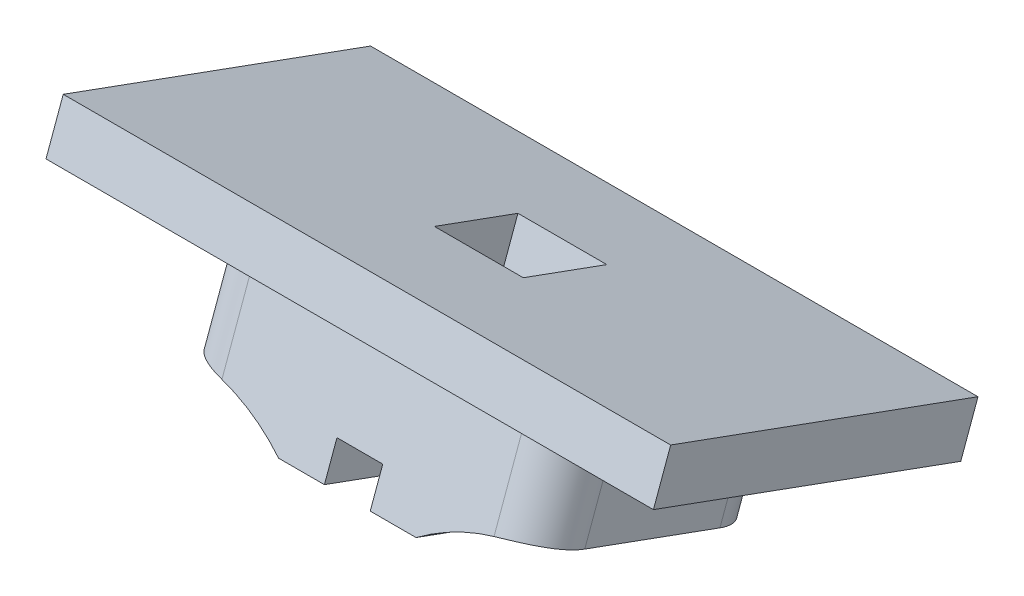
ISO-10303-21;
HEADER;
FILE_DESCRIPTION(('STEP AP214'),'2;1');
FILE_NAME('part.step','',(''),(''),'','','');
FILE_SCHEMA(('AUTOMOTIVE_DESIGN { 1 0 10303 214 1 1 1 1 }'));
ENDSEC;
DATA;
#1=APPLICATION_CONTEXT('core data for automotive mechanical design processes');
#2=APPLICATION_PROTOCOL_DEFINITION('international standard','automotive_design',2000,#1);
#3=PRODUCT_CONTEXT('',#1,'mechanical');
#4=PRODUCT('Part','Part','',(#3));
#5=PRODUCT_RELATED_PRODUCT_CATEGORY('part','',(#4));
#6=PRODUCT_DEFINITION_FORMATION('','',#4);
#7=PRODUCT_DEFINITION_CONTEXT('part definition',#1,'design');
#8=PRODUCT_DEFINITION('design','',#6,#7);
#9=PRODUCT_DEFINITION_SHAPE('','',#8);
#10=(LENGTH_UNIT() NAMED_UNIT(*) SI_UNIT(.MILLI.,.METRE.));
#11=(NAMED_UNIT(*) PLANE_ANGLE_UNIT() SI_UNIT($,.RADIAN.));
#12=(NAMED_UNIT(*) SI_UNIT($,.STERADIAN.) SOLID_ANGLE_UNIT());
#13=UNCERTAINTY_MEASURE_WITH_UNIT(LENGTH_MEASURE(1.E-05),#10,'distance_accuracy_value','');
#14=(GEOMETRIC_REPRESENTATION_CONTEXT(3) GLOBAL_UNCERTAINTY_ASSIGNED_CONTEXT((#13)) GLOBAL_UNIT_ASSIGNED_CONTEXT((#10,
#11,#12)) REPRESENTATION_CONTEXT('',''));
#15=CARTESIAN_POINT('',(0.,0.,0.));
#16=DIRECTION('',(0.,0.,1.));
#17=DIRECTION('',(1.,0.,0.));
#18=AXIS2_PLACEMENT_3D('',#15,#16,#17);
#19=CARTESIAN_POINT('',(-3.95,-152.499400824487,40.7595126358428));
#20=DIRECTION('',(0.,-0.34202014332567,-0.939692620785908));
#21=DIRECTION('',(0.,0.939692620785908,-0.34202014332567));
#22=AXIS2_PLACEMENT_3D('',#19,#20,#21);
#23=PLANE('',#22);
#24=CARTESIAN_POINT('',(2.98999999999998,-145.409009990394,38.1788214229189));
#25=DIRECTION('',(0.,-0.34202014332567,-0.939692620785908));
#26=DIRECTION('',(0.,0.939692620785908,-0.34202014332567));
#27=AXIS2_PLACEMENT_3D('',#24,#25,#26);
#28=CIRCLE('',#27,4.21306250000007);
#29=CARTESIAN_POINT('',(1.98999999999998,-141.563164173265,36.7790480199069));
#30=VERTEX_POINT('',#29);
#31=CARTESIAN_POINT('',(0.520000000000069,-142.201780344863,37.0114852974894));
#32=VERTEX_POINT('',#31);
#33=EDGE_CURVE('E63',#30,#32,#28,.F.);
#34=ORIENTED_EDGE('',*,*,#33,.F.);
#35=DIRECTION('',(0.,0.939692620785908,-0.34202014332567));
#36=VECTOR('',#35,1.);
#37=CARTESIAN_POINT('',(1.98999999999998,-152.499400824487,40.7595126358428));
#38=LINE('',#37,#36);
#39=CARTESIAN_POINT('',(1.98999999999998,-139.476671744584,36.019626881845));
#40=VERTEX_POINT('',#39);
#41=EDGE_CURVE('E368',#30,#40,#38,.T.);
#42=ORIENTED_EDGE('',*,*,#41,.T.);
#43=DIRECTION('',(-1.,0.,0.));
#44=VECTOR('',#43,1.);
#45=CARTESIAN_POINT('',(-3.95,-139.476671744584,36.019626881845));
#46=LINE('',#45,#44);
#47=CARTESIAN_POINT('',(-3.95,-139.476671744584,36.019626881845));
#48=VERTEX_POINT('',#47);
#49=EDGE_CURVE('E456',#40,#48,#46,.T.);
#50=ORIENTED_EDGE('',*,*,#49,.T.);
#51=DIRECTION('',(0.,0.939692620785908,-0.34202014332567));
#52=VECTOR('',#51,1.);
#53=CARTESIAN_POINT('',(-3.95,-152.499400824487,40.7595126358428));
#54=LINE('',#53,#52);
#55=CARTESIAN_POINT('',(-3.95,-141.563164173265,36.7790480199069));
#56=VERTEX_POINT('',#55);
#57=EDGE_CURVE('E459',#56,#48,#54,.T.);
#58=ORIENTED_EDGE('',*,*,#57,.F.);
#59=CARTESIAN_POINT('',(-4.95,-145.409009990394,38.178821422919));
#60=DIRECTION('',(0.,-0.34202014332567,-0.939692620785908));
#61=DIRECTION('',(0.,0.939692620785908,-0.34202014332567));
#62=AXIS2_PLACEMENT_3D('',#59,#60,#61);
#63=CIRCLE('',#62,4.21306250000007);
#64=CARTESIAN_POINT('',(-2.48000000000001,-142.201780344863,37.0114852974894));
#65=VERTEX_POINT('',#64);
#66=EDGE_CURVE('E297',#56,#65,#63,.T.);
#67=ORIENTED_EDGE('',*,*,#66,.T.);
#68=DIRECTION('',(1.,0.,0.));
#69=VECTOR('',#68,1.);
#70=CARTESIAN_POINT('',(-3.95,-142.201780344863,37.0114852974894));
#71=LINE('',#70,#69);
#72=CARTESIAN_POINT('',(-1.48000000000001,-142.201780344863,37.0114852974894));
#73=VERTEX_POINT('',#72);
#74=EDGE_CURVE('E380',#65,#73,#71,.T.);
#75=ORIENTED_EDGE('',*,*,#74,.T.);
#76=DIRECTION('',(0.,0.939692620785908,-0.34202014332567));
#77=VECTOR('',#76,1.);
#78=CARTESIAN_POINT('',(-1.48,-152.499400824487,40.7595126358428));
#79=LINE('',#78,#77);
#80=CARTESIAN_POINT('',(-1.48000000000001,-141.450026248234,36.7378691828289));
#81=VERTEX_POINT('',#80);
#82=EDGE_CURVE('E430',#73,#81,#79,.T.);
#83=ORIENTED_EDGE('',*,*,#82,.T.);
#84=DIRECTION('',(1.,0.,0.));
#85=VECTOR('',#84,1.);
#86=CARTESIAN_POINT('',(-3.95,-141.450026248234,36.7378691828289));
#87=LINE('',#86,#85);
#88=CARTESIAN_POINT('',(-0.48000000000001,-141.450026248234,36.7378691828289));
#89=VERTEX_POINT('',#88);
#90=EDGE_CURVE('E437',#81,#89,#87,.T.);
#91=ORIENTED_EDGE('',*,*,#90,.T.);
#92=DIRECTION('',(0.,-0.939692620785908,0.34202014332567));
#93=VECTOR('',#92,1.);
#94=CARTESIAN_POINT('',(-0.48000000000001,-152.499400824487,40.7595126358428));
#95=LINE('',#94,#93);
#96=CARTESIAN_POINT('',(-0.48000000000001,-142.201780344863,37.0114852974894));
#97=VERTEX_POINT('',#96);
#98=EDGE_CURVE('E296',#89,#97,#95,.T.);
#99=ORIENTED_EDGE('',*,*,#98,.T.);
#100=EDGE_CURVE('E377',#97,#32,#71,.T.);
#101=ORIENTED_EDGE('',*,*,#100,.T.);
#102=EDGE_LOOP('',(#34,#42,#50,#58,#67,#75,#83,#91,#99,#101));
#103=FACE_BOUND('',#102,.T.);
#104=ADVANCED_FACE('F41',(#103),#23,.F.);
#105=CARTESIAN_POINT('',(1.98999999999998,-152.841420967813,39.8198200150569));
#106=DIRECTION('',(0.,0.939692620785908,-0.34202014332567));
#107=DIRECTION('',(0.,0.34202014332567,0.939692620785908));
#108=AXIS2_PLACEMENT_3D('',#105,#106,#107);
#109=CYLINDRICAL_SURFACE('',#108,1.);
#110=CARTESIAN_POINT('',(2.98999999999999,-141.79204639156,35.798176562043));
#111=CARTESIAN_POINT('',(2.98999981089762,-141.782430627456,35.8246003928696));
#112=CARTESIAN_POINT('',(2.98881323349564,-141.772816253737,35.8510103987671));
#113=CARTESIAN_POINT('',(2.98407947173324,-141.753662740468,35.9036440730904));
#114=CARTESIAN_POINT('',(2.98053239500554,-141.744123597509,35.9298677499574));
#115=CARTESIAN_POINT('',(2.9663831501654,-141.715755726127,36.0079440903159));
#116=CARTESIAN_POINT('',(2.95227288035967,-141.697146284109,36.0592849972348));
#117=CARTESIAN_POINT('',(2.91508864291902,-141.661334197043,36.1591341537159));
#118=CARTESIAN_POINT('',(2.89201009605694,-141.644132276118,36.2076409415902));
#119=CARTESIAN_POINT('',(2.83755084831836,-141.612027729396,36.3005841327094));
#120=CARTESIAN_POINT('',(2.80617154510596,-141.59712471718,36.345021219508));
#121=CARTESIAN_POINT('',(2.7361073282988,-141.570573934311,36.4286297009068));
#122=CARTESIAN_POINT('',(2.69743980668151,-141.55891857456,36.4678132587411));
#123=CARTESIAN_POINT('',(2.61390616137842,-141.53968340188,36.5401073207501));
#124=CARTESIAN_POINT('',(2.56904027416754,-141.532103433523,36.5732180564979));
#125=CARTESIAN_POINT('',(2.47495723246723,-141.52178511548,36.6323312982211));
#126=CARTESIAN_POINT('',(2.42578605235699,-141.519000924137,36.6583990753581));
#127=CARTESIAN_POINT('',(2.32423345518071,-141.518594377797,36.7033311777244));
#128=CARTESIAN_POINT('',(2.27185268727983,-141.520970982316,36.7221969540722));
#129=CARTESIAN_POINT('',(2.18098361680717,-141.529569693242,36.7480470944907));
#130=CARTESIAN_POINT('',(2.14288144224999,-141.534473656925,36.7568910024878));
#131=CARTESIAN_POINT('',(2.06647677901283,-141.546884747217,36.7707956767958));
#132=CARTESIAN_POINT('',(2.02817472137313,-141.554387591081,36.7758626241977));
#133=CARTESIAN_POINT('',(1.98999999999999,-141.563164173265,36.7790480199069));
#134=B_SPLINE_CURVE_WITH_KNOTS('',3,(#110,#111,#112,#113,#114,#115,#116,#117,#118,#119,#120,
#121,#122,#123,#124,#125,#126,#127,#128,#129,#130,#131,#132,#133),.UNSPECIFIED.,.F.,.F.,(4,2,2,
2,2,2,2,2,2,2,2,4),(0.,0.0843054131839854,0.168606982519986,0.336948632178145,0.505376350731911,
0.673775727807577,0.84177822533461,1.00977431513839,1.17615547140108,1.34250308610157,
1.46051200876002,1.57832738027522),.UNSPECIFIED.);
#135=CARTESIAN_POINT('',(2.98999999999998,-141.79204639156,35.798176562043));
#136=VERTEX_POINT('',#135);
#137=EDGE_CURVE('E238',#136,#30,#134,.T.);
#138=ORIENTED_EDGE('',*,*,#137,.F.);
#139=DIRECTION('',(0.,0.939692620785908,-0.34202014332567));
#140=VECTOR('',#139,1.);
#141=CARTESIAN_POINT('',(2.98999999999998,-152.841420967813,39.8198200150569));
#142=LINE('',#141,#140);
#143=CARTESIAN_POINT('',(2.98999999999998,-139.81869188791,35.0799342610591));
#144=VERTEX_POINT('',#143);
#145=EDGE_CURVE('E357',#136,#144,#142,.T.);
#146=ORIENTED_EDGE('',*,*,#145,.T.);
#147=CARTESIAN_POINT('',(1.98999999999998,-139.81869188791,35.0799342610591));
#148=DIRECTION('',(0.,-0.939692620785908,0.34202014332567));
#149=DIRECTION('',(0.,-0.34202014332567,-0.939692620785908));
#150=AXIS2_PLACEMENT_3D('',#147,#148,#149);
#151=CIRCLE('',#150,1.);
#152=EDGE_CURVE('E453',#144,#40,#151,.T.);
#153=ORIENTED_EDGE('',*,*,#152,.T.);
#154=ORIENTED_EDGE('',*,*,#41,.F.);
#155=EDGE_LOOP('',(#138,#146,#153,#154));
#156=FACE_BOUND('',#155,.T.);
#157=ADVANCED_FACE('F336',(#156),#109,.T.);
#158=CARTESIAN_POINT('',(2.98999999999998,-152.841420967813,39.8198200150569));
#159=DIRECTION('',(-1.,0.,0.));
#160=DIRECTION('',(0.,0.,1.));
#161=AXIS2_PLACEMENT_3D('',#158,#159,#160);
#162=PLANE('',#161);
#163=DIRECTION('',(0.,-0.34202014332567,-0.939692620785908));
#164=VECTOR('',#163,1.);
#165=CARTESIAN_POINT('',(2.98999999999998,-140.9703248709,38.0558378851355));
#166=LINE('',#165,#164);
#167=CARTESIAN_POINT('',(2.98999999999998,-142.865989641602,32.8475417327752));
#168=VERTEX_POINT('',#167);
#169=EDGE_CURVE('E227',#136,#168,#166,.T.);
#170=ORIENTED_EDGE('',*,*,#169,.T.);
#171=DIRECTION('',(0.,0.939692620785908,-0.34202014332567));
#172=VECTOR('',#171,1.);
#173=CARTESIAN_POINT('',(2.98999999999998,-153.915364217856,36.8691851857891));
#174=LINE('',#173,#172);
#175=CARTESIAN_POINT('',(2.98999999999998,-140.892635137952,32.1292994317914));
#176=VERTEX_POINT('',#175);
#177=EDGE_CURVE('E355',#168,#176,#174,.T.);
#178=ORIENTED_EDGE('',*,*,#177,.T.);
#179=DIRECTION('',(0.,0.342020143325665,0.93969262078591));
#180=VECTOR('',#179,1.);
#181=CARTESIAN_POINT('',(2.98999999999998,-139.81869188791,35.0799342610591));
#182=LINE('',#181,#180);
#183=EDGE_CURVE('E451',#176,#144,#182,.T.);
#184=ORIENTED_EDGE('',*,*,#183,.T.);
#185=ORIENTED_EDGE('',*,*,#145,.F.);
#186=EDGE_LOOP('',(#170,#178,#184,#185));
#187=FACE_BOUND('',#186,.T.);
#188=ADVANCED_FACE('F342',(#187),#162,.F.);
#189=CARTESIAN_POINT('',(1.98999999999998,-153.915364217856,36.8691851857891));
#190=DIRECTION('',(0.,0.939692620785908,-0.34202014332567));
#191=DIRECTION('',(0.,0.34202014332567,0.939692620785908));
#192=AXIS2_PLACEMENT_3D('',#189,#190,#191);
#193=CYLINDRICAL_SURFACE('',#192,1.);
#194=CARTESIAN_POINT('',(1.98999999999998,-143.321147709959,31.9490279490673));
#195=CARTESIAN_POINT('',(2.01725761619234,-143.314887832722,31.9467497267607));
#196=CARTESIAN_POINT('',(2.04457165974821,-143.308507886292,31.9456143528892));
#197=CARTESIAN_POINT('',(2.09914786208943,-143.29552379229,31.9456577458532));
#198=CARTESIAN_POINT('',(2.12641001370607,-143.288919615822,31.946836812058));
#199=CARTESIAN_POINT('',(2.20779213863846,-143.268814101543,31.9538828470118));
#200=CARTESIAN_POINT('',(2.26157759848619,-143.255003855014,31.9632527506795));
#201=CARTESIAN_POINT('',(2.36656171501323,-143.226668728264,31.9912017022342));
#202=CARTESIAN_POINT('',(2.41775676991292,-143.21214290559,32.0097932042835));
#203=CARTESIAN_POINT('',(2.51588163335731,-143.182396757883,32.0556150282876));
#204=CARTESIAN_POINT('',(2.5628134242521,-143.167176760627,32.0828413084822));
#205=CARTESIAN_POINT('',(2.65032210904977,-143.136208729216,32.1445585611545));
#206=CARTESIAN_POINT('',(2.69098110698206,-143.120471517742,32.1789387526908));
#207=CARTESIAN_POINT('',(2.76556409393619,-143.088188086588,32.2540611119491));
#208=CARTESIAN_POINT('',(2.79948603270636,-143.071641622535,32.2948052096447));
#209=CARTESIAN_POINT('',(2.8597904721098,-143.037609258542,32.3815859706168));
#210=CARTESIAN_POINT('',(2.88612610089256,-143.020118279112,32.4276531726141));
#211=CARTESIAN_POINT('',(2.9302316499596,-142.984347898483,32.5234251644321));
#212=CARTESIAN_POINT('',(2.94800541111419,-142.966068854829,32.5731283116129));
#213=CARTESIAN_POINT('',(2.97079683236867,-142.934121862196,32.6604456922752));
#214=CARTESIAN_POINT('',(2.97799094083284,-142.920592299063,32.6975581289306));
#215=CARTESIAN_POINT('',(2.98759387073146,-142.893378556711,32.7722913875102));
#216=CARTESIAN_POINT('',(2.99000824305151,-142.879694575427,32.8099115685678));
#217=CARTESIAN_POINT('',(2.98999999999998,-142.865989641602,32.8475417327752));
#218=B_SPLINE_CURVE_WITH_KNOTS('',3,(#194,#195,#196,#197,#198,#199,#200,#201,#202,#203,#204,
#205,#206,#207,#208,#209,#210,#211,#212,#213,#214,#215,#216,#217),.UNSPECIFIED.,.F.,.F.,(4,2,2,
2,2,2,2,2,2,2,2,4),(0.,0.0841323298433665,0.168275542794127,0.336349102403099,0.504650273124567,
0.672872781548961,0.838661942125912,1.00450147934268,1.17134469250185,1.33811298961134,
1.45829265842673,1.57833267605111),.UNSPECIFIED.);
#219=CARTESIAN_POINT('',(1.98999999999998,-143.321147709959,31.9490279490673));
#220=VERTEX_POINT('',#219);
#221=EDGE_CURVE('E230',#220,#168,#218,.T.);
#222=ORIENTED_EDGE('',*,*,#221,.F.);
#223=DIRECTION('',(0.,0.939692620785908,-0.34202014332567));
#224=VECTOR('',#223,1.);
#225=CARTESIAN_POINT('',(1.98999999999998,-154.257384361181,35.9294925650032));
#226=LINE('',#225,#224);
#227=CARTESIAN_POINT('',(1.98999999999998,-141.234655281278,31.1896068110054));
#228=VERTEX_POINT('',#227);
#229=EDGE_CURVE('E364',#220,#228,#226,.T.);
#230=ORIENTED_EDGE('',*,*,#229,.T.);
#231=CARTESIAN_POINT('',(1.98999999999998,-140.892635137952,32.1292994317914));
#232=DIRECTION('',(0.,-0.939692620785908,0.34202014332567));
#233=DIRECTION('',(0.,-0.34202014332567,-0.939692620785908));
#234=AXIS2_PLACEMENT_3D('',#231,#232,#233);
#235=CIRCLE('',#234,1.);
#236=EDGE_CURVE('E362',#228,#176,#235,.T.);
#237=ORIENTED_EDGE('',*,*,#236,.T.);
#238=ORIENTED_EDGE('',*,*,#177,.F.);
#239=EDGE_LOOP('',(#222,#230,#237,#238));
#240=FACE_BOUND('',#239,.T.);
#241=ADVANCED_FACE('F245',(#240),#193,.T.);
#242=CARTESIAN_POINT('',(-3.95,-154.257384361181,35.9294925650032));
#243=DIRECTION('',(0.,0.34202014332567,0.939692620785908));
#244=DIRECTION('',(0.,-0.939692620785908,0.34202014332567));
#245=AXIS2_PLACEMENT_3D('',#242,#243,#244);
#246=PLANE('',#245);
#247=CARTESIAN_POINT('',(2.98999999999999,-147.166993527088,33.3488013520793));
#248=DIRECTION('',(0.,0.34202014332567,0.939692620785908));
#249=DIRECTION('',(0.,0.939692620785908,-0.34202014332567));
#250=AXIS2_PLACEMENT_3D('',#247,#248,#249);
#251=CIRCLE('',#250,4.21306250000007);
#252=CARTESIAN_POINT('',(0.519999999999994,-143.959763881557,32.1814652266498));
#253=VERTEX_POINT('',#252);
#254=EDGE_CURVE('E223',#220,#253,#251,.T.);
#255=ORIENTED_EDGE('',*,*,#254,.T.);
#256=DIRECTION('',(-1.,0.,0.));
#257=VECTOR('',#256,1.);
#258=CARTESIAN_POINT('',(-3.95,-143.959763881557,32.1814652266498));
#259=LINE('',#258,#257);
#260=CARTESIAN_POINT('',(-0.480000000000012,-143.959763881557,32.1814652266498));
#261=VERTEX_POINT('',#260);
#262=EDGE_CURVE('E414',#253,#261,#259,.T.);
#263=ORIENTED_EDGE('',*,*,#262,.T.);
#264=DIRECTION('',(0.,-0.939692620785908,0.342020143325669));
#265=VECTOR('',#264,1.);
#266=CARTESIAN_POINT('',(-0.48000000000001,-143.959763881557,32.1814652266498));
#267=LINE('',#266,#265);
#268=CARTESIAN_POINT('',(-0.48000000000001,-143.208009784928,31.9078491119893));
#269=VERTEX_POINT('',#268);
#270=EDGE_CURVE('E477',#269,#261,#267,.T.);
#271=ORIENTED_EDGE('',*,*,#270,.F.);
#272=DIRECTION('',(1.,0.,0.));
#273=VECTOR('',#272,1.);
#274=CARTESIAN_POINT('',(-1.48000000000001,-143.208009784928,31.9078491119893));
#275=LINE('',#274,#273);
#276=CARTESIAN_POINT('',(-1.48000000000001,-143.208009784928,31.9078491119893));
#277=VERTEX_POINT('',#276);
#278=EDGE_CURVE('E485',#277,#269,#275,.T.);
#279=ORIENTED_EDGE('',*,*,#278,.F.);
#280=DIRECTION('',(0.,0.939692620785908,-0.342020143325669));
#281=VECTOR('',#280,1.);
#282=CARTESIAN_POINT('',(-1.48000000000001,-143.959763881557,32.1814652266498));
#283=LINE('',#282,#281);
#284=CARTESIAN_POINT('',(-1.48000000000001,-143.959763881557,32.1814652266498));
#285=VERTEX_POINT('',#284);
#286=EDGE_CURVE('E484',#285,#277,#283,.T.);
#287=ORIENTED_EDGE('',*,*,#286,.F.);
#288=CARTESIAN_POINT('',(-2.48000000000001,-143.959763881557,32.1814652266498));
#289=VERTEX_POINT('',#288);
#290=EDGE_CURVE('E424',#285,#289,#259,.T.);
#291=ORIENTED_EDGE('',*,*,#290,.T.);
#292=CARTESIAN_POINT('',(-4.95,-147.166993527088,33.3488013520793));
#293=DIRECTION('',(0.,-0.34202014332567,-0.939692620785908));
#294=DIRECTION('',(0.,0.939692620785908,-0.34202014332567));
#295=AXIS2_PLACEMENT_3D('',#292,#293,#294);
#296=CIRCLE('',#295,4.21306250000007);
#297=CARTESIAN_POINT('',(-3.95,-143.321147709959,31.9490279490673));
#298=VERTEX_POINT('',#297);
#299=EDGE_CURVE('E483',#298,#289,#296,.T.);
#300=ORIENTED_EDGE('',*,*,#299,.F.);
#301=DIRECTION('',(0.,0.939692620785908,-0.34202014332567));
#302=VECTOR('',#301,1.);
#303=CARTESIAN_POINT('',(-3.95,-154.257384361181,35.9294925650032));
#304=LINE('',#303,#302);
#305=CARTESIAN_POINT('',(-3.95,-141.234655281278,31.1896068110054));
#306=VERTEX_POINT('',#305);
#307=EDGE_CURVE('E366',#298,#306,#304,.T.);
#308=ORIENTED_EDGE('',*,*,#307,.T.);
#309=DIRECTION('',(1.,0.,0.));
#310=VECTOR('',#309,1.);
#311=CARTESIAN_POINT('',(-3.95,-141.234655281278,31.1896068110054));
#312=LINE('',#311,#310);
#313=EDGE_CURVE('E447',#306,#228,#312,.T.);
#314=ORIENTED_EDGE('',*,*,#313,.T.);
#315=ORIENTED_EDGE('',*,*,#229,.F.);
#316=EDGE_LOOP('',(#255,#263,#271,#279,#287,#291,#300,#308,#314,#315));
#317=FACE_BOUND('',#316,.T.);
#318=ADVANCED_FACE('F305',(#317),#246,.F.);
#319=CARTESIAN_POINT('',(22.9,-146.073448367309,26.3741648301929));
#320=DIRECTION('',(0.,0.939692620785908,-0.342020143325668));
#321=DIRECTION('',(0.,0.342020143325668,0.939692620785909));
#322=AXIS2_PLACEMENT_3D('',#319,#320,#321);
#323=PLANE('',#322);
#324=DIRECTION('',(0.,-0.34202014332567,-0.939692620785908));
#325=VECTOR('',#324,1.);
#326=CARTESIAN_POINT('',(0.520000000000067,-141.722078967529,38.329453999796));
#327=LINE('',#326,#325);
#328=EDGE_CURVE('E12',#32,#253,#327,.T.);
#329=ORIENTED_EDGE('',*,*,#328,.F.);
#330=ORIENTED_EDGE('',*,*,#100,.F.);
#331=DIRECTION('',(0.,-0.342020143325668,-0.939692620785909));
#332=VECTOR('',#331,1.);
#333=CARTESIAN_POINT('',(-0.480000000000012,-146.073448367309,26.3741648301929));
#334=LINE('',#333,#332);
#335=EDGE_CURVE('E417',#97,#261,#334,.T.);
#336=ORIENTED_EDGE('',*,*,#335,.T.);
#337=ORIENTED_EDGE('',*,*,#262,.F.);
#338=EDGE_LOOP('',(#329,#330,#336,#337));
#339=FACE_BOUND('',#338,.T.);
#340=ADVANCED_FACE('F275',(#339),#323,.F.);
#341=ORIENTED_EDGE('',*,*,#290,.F.);
#342=DIRECTION('',(0.,0.342020143325668,0.939692620785909));
#343=VECTOR('',#342,1.);
#344=CARTESIAN_POINT('',(-1.48000000000001,-146.073448367309,26.3741648301929));
#345=LINE('',#344,#343);
#346=EDGE_CURVE('E49',#285,#73,#345,.T.);
#347=ORIENTED_EDGE('',*,*,#346,.T.);
#348=ORIENTED_EDGE('',*,*,#74,.F.);
#349=DIRECTION('',(0.,-0.34202014332567,-0.939692620785908));
#350=VECTOR('',#349,1.);
#351=CARTESIAN_POINT('',(-2.47999999999984,-116.249668362392,108.314326956487));
#352=LINE('',#351,#350);
#353=EDGE_CURVE('E401',#65,#289,#352,.T.);
#354=ORIENTED_EDGE('',*,*,#353,.T.);
#355=EDGE_LOOP('',(#341,#347,#348,#354));
#356=FACE_BOUND('',#355,.T.);
#357=ADVANCED_FACE('F327',(#356),#323,.F.);
#358=CARTESIAN_POINT('',(5.65,-155.91649713121,35.4691824561086));
#359=DIRECTION('',(-1.,0.,0.));
#360=DIRECTION('',(0.,0.,1.));
#361=AXIS2_PLACEMENT_3D('',#358,#359,#360);
#362=PLANE('',#361);
#363=DIRECTION('',(0.,0.342020143325668,0.939692620785909));
#364=VECTOR('',#363,1.);
#365=CARTESIAN_POINT('',(5.65,-141.576675424603,30.2499141902195));
#366=LINE('',#365,#364);
#367=CARTESIAN_POINT('',(5.65,-141.576675424603,30.2499141902195));
#368=VERTEX_POINT('',#367);
#369=CARTESIAN_POINT('',(5.65,-139.134651601258,36.9593195026309));
#370=VERTEX_POINT('',#369);
#371=EDGE_CURVE('E405',#368,#370,#366,.T.);
#372=ORIENTED_EDGE('',*,*,#371,.F.);
#373=DIRECTION('',(0.,0.939692620785908,-0.342020143325669));
#374=VECTOR('',#373,1.);
#375=CARTESIAN_POINT('',(5.65,-155.91649713121,35.4691824561086));
#376=LINE('',#375,#374);
#377=CARTESIAN_POINT('',(5.65,-140.543013541739,29.8736920325613));
#378=VERTEX_POINT('',#377);
#379=EDGE_CURVE('E397',#368,#378,#376,.T.);
#380=ORIENTED_EDGE('',*,*,#379,.T.);
#381=DIRECTION('',(0.,0.342020143325671,0.939692620785907));
#382=VECTOR('',#381,1.);
#383=CARTESIAN_POINT('',(5.65,-140.543013541739,29.8736920325613));
#384=LINE('',#383,#382);
#385=CARTESIAN_POINT('',(5.65,-138.100989718394,36.5830973449726));
#386=VERTEX_POINT('',#385);
#387=EDGE_CURVE('E394',#378,#386,#384,.T.);
#388=ORIENTED_EDGE('',*,*,#387,.T.);
#389=DIRECTION('',(0.,0.939692620785908,-0.342020143325669));
#390=VECTOR('',#389,1.);
#391=CARTESIAN_POINT('',(5.65,-153.474473307864,42.17858776852));
#392=LINE('',#391,#390);
#393=EDGE_CURVE('E393',#370,#386,#392,.T.);
#394=ORIENTED_EDGE('',*,*,#393,.F.);
#395=EDGE_LOOP('',(#372,#380,#388,#394));
#396=FACE_BOUND('',#395,.T.);
#397=ADVANCED_FACE('F324',(#396),#362,.F.);
#398=CARTESIAN_POINT('',(5.65,-153.474473307864,42.17858776852));
#399=DIRECTION('',(0.,-0.342020143325669,-0.939692620785908));
#400=DIRECTION('',(0.,0.939692620785908,-0.342020143325669));
#401=AXIS2_PLACEMENT_3D('',#398,#399,#400);
#402=PLANE('',#401);
#403=DIRECTION('',(-1.,0.,0.));
#404=VECTOR('',#403,1.);
#405=CARTESIAN_POINT('',(5.65,-139.134651601258,36.9593195026309));
#406=LINE('',#405,#404);
#407=CARTESIAN_POINT('',(-7.61000000000001,-139.134651601258,36.9593195026309));
#408=VERTEX_POINT('',#407);
#409=EDGE_CURVE('E402',#370,#408,#406,.T.);
#410=ORIENTED_EDGE('',*,*,#409,.F.);
#411=ORIENTED_EDGE('',*,*,#393,.T.);
#412=DIRECTION('',(-1.,0.,0.));
#413=VECTOR('',#412,1.);
#414=CARTESIAN_POINT('',(5.65,-138.100989718394,36.5830973449726));
#415=LINE('',#414,#413);
#416=CARTESIAN_POINT('',(-7.61000000000001,-138.100989718394,36.5830973449726));
#417=VERTEX_POINT('',#416);
#418=EDGE_CURVE('E390',#386,#417,#415,.T.);
#419=ORIENTED_EDGE('',*,*,#418,.T.);
#420=DIRECTION('',(0.,0.939692620785908,-0.342020143325669));
#421=VECTOR('',#420,1.);
#422=CARTESIAN_POINT('',(-7.61000000000001,-153.474473307864,42.17858776852));
#423=LINE('',#422,#421);
#424=EDGE_CURVE('E389',#408,#417,#423,.T.);
#425=ORIENTED_EDGE('',*,*,#424,.F.);
#426=EDGE_LOOP('',(#410,#411,#419,#425));
#427=FACE_BOUND('',#426,.T.);
#428=ADVANCED_FACE('F321',(#427),#402,.F.);
#429=CARTESIAN_POINT('',(-7.61,-155.91649713121,35.4691824561086));
#430=DIRECTION('',(1.,0.,0.));
#431=DIRECTION('',(0.,0.,-1.));
#432=AXIS2_PLACEMENT_3D('',#429,#430,#431);
#433=PLANE('',#432);
#434=DIRECTION('',(0.,-0.342020143325668,-0.939692620785909));
#435=VECTOR('',#434,1.);
#436=CARTESIAN_POINT('',(-7.61,-141.576675424603,30.2499141902195));
#437=LINE('',#436,#435);
#438=CARTESIAN_POINT('',(-7.61,-141.576675424603,30.2499141902195));
#439=VERTEX_POINT('',#438);
#440=EDGE_CURVE('E398',#408,#439,#437,.T.);
#441=ORIENTED_EDGE('',*,*,#440,.F.);
#442=ORIENTED_EDGE('',*,*,#424,.T.);
#443=DIRECTION('',(0.,-0.342020143325672,-0.939692620785907));
#444=VECTOR('',#443,1.);
#445=CARTESIAN_POINT('',(-7.61,-140.543013541739,29.8736920325613));
#446=LINE('',#445,#444);
#447=CARTESIAN_POINT('',(-7.61,-140.543013541739,29.8736920325613));
#448=VERTEX_POINT('',#447);
#449=EDGE_CURVE('E386',#417,#448,#446,.T.);
#450=ORIENTED_EDGE('',*,*,#449,.T.);
#451=DIRECTION('',(0.,0.939692620785908,-0.342020143325669));
#452=VECTOR('',#451,1.);
#453=CARTESIAN_POINT('',(-7.61,-155.91649713121,35.4691824561086));
#454=LINE('',#453,#452);
#455=EDGE_CURVE('E385',#439,#448,#454,.T.);
#456=ORIENTED_EDGE('',*,*,#455,.F.);
#457=EDGE_LOOP('',(#441,#442,#450,#456));
#458=FACE_BOUND('',#457,.T.);
#459=ADVANCED_FACE('F317',(#458),#433,.F.);
#460=CARTESIAN_POINT('',(5.65,-155.91649713121,35.4691824561086));
#461=DIRECTION('',(0.,0.342020143325669,0.939692620785908));
#462=DIRECTION('',(0.,-0.939692620785908,0.342020143325669));
#463=AXIS2_PLACEMENT_3D('',#460,#461,#462);
#464=PLANE('',#463);
#465=DIRECTION('',(1.,0.,0.));
#466=VECTOR('',#465,1.);
#467=CARTESIAN_POINT('',(5.65,-141.576675424603,30.2499141902195));
#468=LINE('',#467,#466);
#469=EDGE_CURVE('E384',#439,#368,#468,.T.);
#470=ORIENTED_EDGE('',*,*,#469,.F.);
#471=ORIENTED_EDGE('',*,*,#455,.T.);
#472=DIRECTION('',(1.,0.,0.));
#473=VECTOR('',#472,1.);
#474=CARTESIAN_POINT('',(5.65,-140.543013541739,29.8736920325613));
#475=LINE('',#474,#473);
#476=EDGE_CURVE('E381',#448,#378,#475,.T.);
#477=ORIENTED_EDGE('',*,*,#476,.T.);
#478=ORIENTED_EDGE('',*,*,#379,.F.);
#479=EDGE_LOOP('',(#470,#471,#477,#478));
#480=FACE_BOUND('',#479,.T.);
#481=ADVANCED_FACE('F314',(#480),#464,.F.);
#482=CARTESIAN_POINT('',(0.,-133.703823589352,48.664211994104));
#483=DIRECTION('',(0.,-0.939692620785908,0.342020143325671));
#484=DIRECTION('',(0.,-0.342020143325671,-0.939692620785908));
#485=AXIS2_PLACEMENT_3D('',#482,#483,#484);
#486=PLANE('',#485);
#487=DIRECTION('',(1.,0.,0.));
#488=VECTOR('',#487,1.);
#489=CARTESIAN_POINT('',(-1.95000000000001,-138.99024209104,34.1398965309293));
#490=LINE('',#489,#488);
#491=CARTESIAN_POINT('',(-1.95000000000001,-138.99024209104,34.1398965309293));
#492=VERTEX_POINT('',#491);
#493=CARTESIAN_POINT('',(-0.0100000000000046,-138.99024209104,34.1398965309293));
#494=VERTEX_POINT('',#493);
#495=EDGE_CURVE('E205',#492,#494,#490,.T.);
#496=ORIENTED_EDGE('',*,*,#495,.F.);
#497=DIRECTION('',(0.,0.342020143325663,0.93969262078591));
#498=VECTOR('',#497,1.);
#499=CARTESIAN_POINT('',(-1.95000000000001,-138.99024209104,34.1398965309293));
#500=LINE('',#499,#498);
#501=CARTESIAN_POINT('',(-1.95,-139.653761169092,32.3168928466046));
#502=VERTEX_POINT('',#501);
#503=EDGE_CURVE('E56',#502,#492,#500,.T.);
#504=ORIENTED_EDGE('',*,*,#503,.F.);
#505=DIRECTION('',(-1.,0.,0.));
#506=VECTOR('',#505,1.);
#507=CARTESIAN_POINT('',(-1.95,-139.653761169092,32.3168928466046));
#508=LINE('',#507,#506);
#509=CARTESIAN_POINT('',(-0.0100000000000046,-139.653761169092,32.3168928466046));
#510=VERTEX_POINT('',#509);
#511=EDGE_CURVE('E212',#510,#502,#508,.T.);
#512=ORIENTED_EDGE('',*,*,#511,.F.);
#513=DIRECTION('',(0.,-0.342020143325663,-0.93969262078591));
#514=VECTOR('',#513,1.);
#515=CARTESIAN_POINT('',(-0.0100000000000046,-138.99024209104,34.1398965309293));
#516=LINE('',#515,#514);
#517=EDGE_CURVE('E195',#494,#510,#516,.T.);
#518=ORIENTED_EDGE('',*,*,#517,.F.);
#519=EDGE_LOOP('',(#496,#504,#512,#518));
#520=FACE_BOUND('',#519,.T.);
#521=ORIENTED_EDGE('',*,*,#387,.F.);
#522=ORIENTED_EDGE('',*,*,#476,.F.);
#523=ORIENTED_EDGE('',*,*,#449,.F.);
#524=ORIENTED_EDGE('',*,*,#418,.F.);
#525=EDGE_LOOP('',(#521,#522,#523,#524));
#526=FACE_BOUND('',#525,.T.);
#527=ADVANCED_FACE('F209',(#520,#526),#486,.F.);
#528=CARTESIAN_POINT('',(0.,-134.737485472217,49.0404341517618));
#529=DIRECTION('',(0.,-0.939692620785909,0.342020143325668));
#530=DIRECTION('',(0.,-0.342020143325668,-0.939692620785909));
#531=AXIS2_PLACEMENT_3D('',#528,#529,#530);
#532=PLANE('',#531);
#533=CARTESIAN_POINT('',(-3.95,-139.81869188791,35.0799342610591));
#534=DIRECTION('',(0.,-0.939692620785908,0.34202014332567));
#535=DIRECTION('',(0.,-0.34202014332567,-0.939692620785908));
#536=AXIS2_PLACEMENT_3D('',#533,#534,#535);
#537=CIRCLE('',#536,1.);
#538=CARTESIAN_POINT('',(-4.95,-139.81869188791,35.0799342610591));
#539=VERTEX_POINT('',#538);
#540=EDGE_CURVE('E438',#48,#539,#537,.T.);
#541=ORIENTED_EDGE('',*,*,#540,.F.);
#542=ORIENTED_EDGE('',*,*,#49,.F.);
#543=ORIENTED_EDGE('',*,*,#152,.F.);
#544=ORIENTED_EDGE('',*,*,#183,.F.);
#545=ORIENTED_EDGE('',*,*,#236,.F.);
#546=ORIENTED_EDGE('',*,*,#313,.F.);
#547=CARTESIAN_POINT('',(-3.95,-140.892635137952,32.1292994317914));
#548=DIRECTION('',(0.,-0.939692620785908,0.34202014332567));
#549=DIRECTION('',(0.,-0.34202014332567,-0.939692620785908));
#550=AXIS2_PLACEMENT_3D('',#547,#548,#549);
#551=CIRCLE('',#550,1.);
#552=CARTESIAN_POINT('',(-4.95,-140.892635137952,32.1292994317914));
#553=VERTEX_POINT('',#552);
#554=EDGE_CURVE('E444',#553,#306,#551,.T.);
#555=ORIENTED_EDGE('',*,*,#554,.F.);
#556=DIRECTION('',(0.,-0.342020143325665,-0.93969262078591));
#557=VECTOR('',#556,1.);
#558=CARTESIAN_POINT('',(-4.95,-139.81869188791,35.0799342610591));
#559=LINE('',#558,#557);
#560=EDGE_CURVE('E441',#539,#553,#559,.T.);
#561=ORIENTED_EDGE('',*,*,#560,.F.);
#562=EDGE_LOOP('',(#541,#542,#543,#544,#545,#546,#555,#561));
#563=FACE_BOUND('',#562,.T.);
#564=ORIENTED_EDGE('',*,*,#469,.T.);
#565=ORIENTED_EDGE('',*,*,#371,.T.);
#566=ORIENTED_EDGE('',*,*,#409,.T.);
#567=ORIENTED_EDGE('',*,*,#440,.T.);
#568=EDGE_LOOP('',(#564,#565,#566,#567));
#569=FACE_BOUND('',#568,.T.);
#570=ADVANCED_FACE('F43',(#563,#569),#532,.T.);
#571=CARTESIAN_POINT('',(-3.95,-153.915364217856,36.8691851857891));
#572=DIRECTION('',(0.,0.939692620785908,-0.34202014332567));
#573=DIRECTION('',(0.,0.34202014332567,0.939692620785908));
#574=AXIS2_PLACEMENT_3D('',#571,#572,#573);
#575=CYLINDRICAL_SURFACE('',#574,1.);
#576=ORIENTED_EDGE('',*,*,#307,.F.);
#577=CARTESIAN_POINT('',(-3.95,-143.321147709959,31.9490279490673));
#578=CARTESIAN_POINT('',(-3.97725761619237,-143.314887832722,31.9467497267607));
#579=CARTESIAN_POINT('',(-4.00457165974823,-143.308507886292,31.9456143528892));
#580=CARTESIAN_POINT('',(-4.05914786208945,-143.29552379229,31.9456577458532));
#581=CARTESIAN_POINT('',(-4.08641001370609,-143.288919615822,31.946836812058));
#582=CARTESIAN_POINT('',(-4.16779213863847,-143.268814101543,31.9538828470118));
#583=CARTESIAN_POINT('',(-4.2215775984862,-143.255003855014,31.9632527506794));
#584=CARTESIAN_POINT('',(-4.32656171501325,-143.226668728264,31.9912017022342));
#585=CARTESIAN_POINT('',(-4.37775676991294,-143.21214290559,32.0097932042835));
#586=CARTESIAN_POINT('',(-4.47588163335733,-143.182396757883,32.0556150282876));
#587=CARTESIAN_POINT('',(-4.52281342425211,-143.167176760627,32.0828413084822));
#588=CARTESIAN_POINT('',(-4.61032210904978,-143.136208729216,32.1445585611545));
#589=CARTESIAN_POINT('',(-4.65098110698207,-143.120471517742,32.1789387526908));
#590=CARTESIAN_POINT('',(-4.7255640939362,-143.088188086588,32.2540611119491));
#591=CARTESIAN_POINT('',(-4.75948603270637,-143.071641622535,32.2948052096447));
#592=CARTESIAN_POINT('',(-4.81979047210982,-143.037609258542,32.3815859706168));
#593=CARTESIAN_POINT('',(-4.84612610089257,-143.020118279112,32.427653172614));
#594=CARTESIAN_POINT('',(-4.89023164995961,-142.984347898483,32.5234251644321));
#595=CARTESIAN_POINT('',(-4.9080054111142,-142.966068854829,32.5731283116128));
#596=CARTESIAN_POINT('',(-4.93079683236869,-142.934121862196,32.6604456922751));
#597=CARTESIAN_POINT('',(-4.93799094083285,-142.920592299063,32.6975581289306));
#598=CARTESIAN_POINT('',(-4.94759387073148,-142.893378556711,32.7722913875102));
#599=CARTESIAN_POINT('',(-4.95000824305153,-142.879694575427,32.8099115685678));
#600=CARTESIAN_POINT('',(-4.95,-142.865989641602,32.8475417327752));
#601=B_SPLINE_CURVE_WITH_KNOTS('',3,(#577,#578,#579,#580,#581,#582,#583,#584,#585,#586,#587,
#588,#589,#590,#591,#592,#593,#594,#595,#596,#597,#598,#599,#600),.UNSPECIFIED.,.F.,.F.,(4,2,2,
2,2,2,2,2,2,2,2,4),(0.,0.0841323298433709,0.16827554279413,0.336349102403091,0.504650273124572,
0.672872781548954,0.838661942125902,1.00450147934268,1.17134469250183,1.33811298961132,
1.45829265842672,1.57833267605111),.UNSPECIFIED.);
#602=CARTESIAN_POINT('',(-4.95,-142.865989641602,32.8475417327752));
#603=VERTEX_POINT('',#602);
#604=EDGE_CURVE('E288',#298,#603,#601,.T.);
#605=ORIENTED_EDGE('',*,*,#604,.T.);
#606=DIRECTION('',(0.,0.939692620785908,-0.34202014332567));
#607=VECTOR('',#606,1.);
#608=CARTESIAN_POINT('',(-4.95,-153.915364217856,36.8691851857891));
#609=LINE('',#608,#607);
#610=EDGE_CURVE('E373',#603,#553,#609,.T.);
#611=ORIENTED_EDGE('',*,*,#610,.T.);
#612=ORIENTED_EDGE('',*,*,#554,.T.);
#613=EDGE_LOOP('',(#576,#605,#611,#612));
#614=FACE_BOUND('',#613,.T.);
#615=ADVANCED_FACE('F299',(#614),#575,.T.);
#616=CARTESIAN_POINT('',(-4.95,-152.841420967813,39.8198200150569));
#617=DIRECTION('',(1.,0.,0.));
#618=DIRECTION('',(0.,1.,0.));
#619=AXIS2_PLACEMENT_3D('',#616,#617,#618);
#620=PLANE('',#619);
#621=ORIENTED_EDGE('',*,*,#610,.F.);
#622=DIRECTION('',(0.,-0.34202014332567,-0.939692620785908));
#623=VECTOR('',#622,1.);
#624=CARTESIAN_POINT('',(-4.95,-115.497914265763,108.040710841827));
#625=LINE('',#624,#623);
#626=CARTESIAN_POINT('',(-4.95,-141.79204639156,35.798176562043));
#627=VERTEX_POINT('',#626);
#628=EDGE_CURVE('E482',#627,#603,#625,.T.);
#629=ORIENTED_EDGE('',*,*,#628,.F.);
#630=DIRECTION('',(0.,0.939692620785908,-0.34202014332567));
#631=VECTOR('',#630,1.);
#632=CARTESIAN_POINT('',(-4.95,-152.841420967813,39.8198200150569));
#633=LINE('',#632,#631);
#634=EDGE_CURVE('E375',#627,#539,#633,.T.);
#635=ORIENTED_EDGE('',*,*,#634,.T.);
#636=ORIENTED_EDGE('',*,*,#560,.T.);
#637=EDGE_LOOP('',(#621,#629,#635,#636));
#638=FACE_BOUND('',#637,.T.);
#639=ADVANCED_FACE('F303',(#638),#620,.F.);
#640=CARTESIAN_POINT('',(-3.95,-152.841420967813,39.8198200150569));
#641=DIRECTION('',(0.,0.939692620785908,-0.34202014332567));
#642=DIRECTION('',(0.,0.34202014332567,0.939692620785908));
#643=AXIS2_PLACEMENT_3D('',#640,#641,#642);
#644=CYLINDRICAL_SURFACE('',#643,1.);
#645=ORIENTED_EDGE('',*,*,#634,.F.);
#646=CARTESIAN_POINT('',(-4.95,-141.79204639156,35.798176562043));
#647=CARTESIAN_POINT('',(-4.94999981089764,-141.782430627456,35.8246003928696));
#648=CARTESIAN_POINT('',(-4.94881323349566,-141.772816253737,35.8510103987671));
#649=CARTESIAN_POINT('',(-4.94407947173326,-141.753662740468,35.9036440730904));
#650=CARTESIAN_POINT('',(-4.94053239500556,-141.744123597509,35.9298677499574));
#651=CARTESIAN_POINT('',(-4.92638315016542,-141.715755726127,36.0079440903159));
#652=CARTESIAN_POINT('',(-4.91227288035969,-141.697146284109,36.0592849972348));
#653=CARTESIAN_POINT('',(-4.87508864291904,-141.661334197043,36.1591341537159));
#654=CARTESIAN_POINT('',(-4.85201009605697,-141.644132276118,36.2076409415902));
#655=CARTESIAN_POINT('',(-4.79755084831838,-141.612027729396,36.3005841327094));
#656=CARTESIAN_POINT('',(-4.76617154510599,-141.59712471718,36.3450212195079));
#657=CARTESIAN_POINT('',(-4.69610732829883,-141.570573934311,36.4286297009068));
#658=CARTESIAN_POINT('',(-4.65743980668153,-141.55891857456,36.4678132587411));
#659=CARTESIAN_POINT('',(-4.57390616137844,-141.53968340188,36.5401073207501));
#660=CARTESIAN_POINT('',(-4.52904027416756,-141.532103433523,36.5732180564979));
#661=CARTESIAN_POINT('',(-4.43495723246726,-141.52178511548,36.6323312982211));
#662=CARTESIAN_POINT('',(-4.38578605235702,-141.519000924137,36.6583990753581));
#663=CARTESIAN_POINT('',(-4.28423345518074,-141.518594377797,36.7033311777244));
#664=CARTESIAN_POINT('',(-4.23185268727986,-141.520970982316,36.7221969540722));
#665=CARTESIAN_POINT('',(-4.14098361680719,-141.529569693242,36.7480470944907));
#666=CARTESIAN_POINT('',(-4.10288144225002,-141.534473656925,36.7568910024878));
#667=CARTESIAN_POINT('',(-4.02647677901285,-141.546884747217,36.7707956767958));
#668=CARTESIAN_POINT('',(-3.98817472137315,-141.554387591081,36.7758626241977));
#669=CARTESIAN_POINT('',(-3.95,-141.563164173265,36.7790480199069));
#670=B_SPLINE_CURVE_WITH_KNOTS('',3,(#646,#647,#648,#649,#650,#651,#652,#653,#654,#655,#656,
#657,#658,#659,#660,#661,#662,#663,#664,#665,#666,#667,#668,#669),.UNSPECIFIED.,.F.,.F.,(4,2,2,
2,2,2,2,2,2,2,2,4),(0.,0.0843054131839788,0.168606982519988,0.336948632178138,0.505376350731903,
0.673775727807567,0.841778225334602,1.00977431513838,1.17615547140108,1.34250308610156,
1.46051200876003,1.57832738027523),.UNSPECIFIED.);
#671=EDGE_CURVE('E279',#627,#56,#670,.T.);
#672=ORIENTED_EDGE('',*,*,#671,.T.);
#673=ORIENTED_EDGE('',*,*,#57,.T.);
#674=ORIENTED_EDGE('',*,*,#540,.T.);
#675=EDGE_LOOP('',(#645,#672,#673,#674));
#676=FACE_BOUND('',#675,.T.);
#677=ADVANCED_FACE('F273',(#676),#644,.T.);
#678=CARTESIAN_POINT('',(-4.95,-119.456898007923,109.481663081917));
#679=DIRECTION('',(0.,-0.34202014332567,-0.939692620785908));
#680=DIRECTION('',(0.,0.939692620785908,-0.34202014332567));
#681=AXIS2_PLACEMENT_3D('',#678,#679,#680);
#682=CYLINDRICAL_SURFACE('',#681,4.21306250000007);
#683=ORIENTED_EDGE('',*,*,#299,.T.);
#684=ORIENTED_EDGE('',*,*,#353,.F.);
#685=ORIENTED_EDGE('',*,*,#66,.F.);
#686=ORIENTED_EDGE('',*,*,#671,.F.);
#687=ORIENTED_EDGE('',*,*,#628,.T.);
#688=ORIENTED_EDGE('',*,*,#604,.F.);
#689=EDGE_LOOP('',(#683,#684,#685,#686,#687,#688));
#690=FACE_BOUND('',#689,.T.);
#691=ADVANCED_FACE('F265',(#690),#682,.F.);
#692=CARTESIAN_POINT('',(-1.48000000000001,-115.497914265763,108.040710841827));
#693=DIRECTION('',(0.,0.939692620785908,-0.34202014332567));
#694=DIRECTION('',(0.,0.34202014332567,0.939692620785908));
#695=AXIS2_PLACEMENT_3D('',#692,#693,#694);
#696=PLANE('',#695);
#697=DIRECTION('',(0.,-0.34202014332567,-0.939692620785908));
#698=VECTOR('',#697,1.);
#699=CARTESIAN_POINT('',(-1.48000000000001,-115.497914265763,108.040710841827));
#700=LINE('',#699,#698);
#701=EDGE_CURVE('E472',#81,#277,#700,.T.);
#702=ORIENTED_EDGE('',*,*,#701,.T.);
#703=ORIENTED_EDGE('',*,*,#278,.T.);
#704=DIRECTION('',(0.,-0.34202014332567,-0.939692620785908));
#705=VECTOR('',#704,1.);
#706=CARTESIAN_POINT('',(-0.48000000000001,-115.497914265763,108.040710841827));
#707=LINE('',#706,#705);
#708=EDGE_CURVE('E471',#89,#269,#707,.T.);
#709=ORIENTED_EDGE('',*,*,#708,.F.);
#710=ORIENTED_EDGE('',*,*,#90,.F.);
#711=EDGE_LOOP('',(#702,#703,#709,#710));
#712=FACE_BOUND('',#711,.T.);
#713=ADVANCED_FACE('F262',(#712),#696,.F.);
#714=CARTESIAN_POINT('',(-1.48000000000001,-116.249668362391,108.314326956487));
#715=DIRECTION('',(-1.,0.,0.));
#716=DIRECTION('',(0.,-1.,0.));
#717=AXIS2_PLACEMENT_3D('',#714,#715,#716);
#718=PLANE('',#717);
#719=ORIENTED_EDGE('',*,*,#346,.F.);
#720=ORIENTED_EDGE('',*,*,#286,.T.);
#721=ORIENTED_EDGE('',*,*,#701,.F.);
#722=ORIENTED_EDGE('',*,*,#82,.F.);
#723=EDGE_LOOP('',(#719,#720,#721,#722));
#724=FACE_BOUND('',#723,.T.);
#725=ADVANCED_FACE('F260',(#724),#718,.F.);
#726=CARTESIAN_POINT('',(-0.48000000000001,-116.249668362391,108.314326956487));
#727=DIRECTION('',(1.,0.,0.));
#728=DIRECTION('',(0.,0.,-1.));
#729=AXIS2_PLACEMENT_3D('',#726,#727,#728);
#730=PLANE('',#729);
#731=ORIENTED_EDGE('',*,*,#708,.T.);
#732=ORIENTED_EDGE('',*,*,#270,.T.);
#733=ORIENTED_EDGE('',*,*,#335,.F.);
#734=ORIENTED_EDGE('',*,*,#98,.F.);
#735=EDGE_LOOP('',(#731,#732,#733,#734));
#736=FACE_BOUND('',#735,.T.);
#737=ADVANCED_FACE('F255',(#736),#730,.F.);
#738=CARTESIAN_POINT('',(2.98999999999998,-144.92930861306,39.4967901252255));
#739=DIRECTION('',(0.,-0.34202014332567,-0.939692620785908));
#740=DIRECTION('',(0.,0.939692620785908,-0.34202014332567));
#741=AXIS2_PLACEMENT_3D('',#738,#739,#740);
#742=CYLINDRICAL_SURFACE('',#741,4.21306250000007);
#743=ORIENTED_EDGE('',*,*,#33,.T.);
#744=ORIENTED_EDGE('',*,*,#328,.T.);
#745=ORIENTED_EDGE('',*,*,#254,.F.);
#746=ORIENTED_EDGE('',*,*,#221,.T.);
#747=ORIENTED_EDGE('',*,*,#169,.F.);
#748=ORIENTED_EDGE('',*,*,#137,.T.);
#749=EDGE_LOOP('',(#743,#744,#745,#746,#747,#748));
#750=FACE_BOUND('',#749,.T.);
#751=ADVANCED_FACE('F249',(#750),#742,.F.);
#752=CARTESIAN_POINT('',(-1.95000000000001,-144.575375012183,36.1727186686456));
#753=DIRECTION('',(-1.,0.,0.));
#754=DIRECTION('',(0.,0.,1.));
#755=AXIS2_PLACEMENT_3D('',#752,#753,#754);
#756=PLANE('',#755);
#757=DIRECTION('',(0.,-0.34202014332567,-0.939692620785908));
#758=VECTOR('',#757,1.);
#759=CARTESIAN_POINT('',(-1.95000000000001,-141.527412167162,35.0633509179086));
#760=LINE('',#759,#758);
#761=CARTESIAN_POINT('',(-1.95000000000001,-141.527412167162,35.0633509179086));
#762=VERTEX_POINT('',#761);
#763=CARTESIAN_POINT('',(-1.95,-142.190931245214,33.2403472335839));
#764=VERTEX_POINT('',#763);
#765=EDGE_CURVE('E224',#762,#764,#760,.T.);
#766=ORIENTED_EDGE('',*,*,#765,.T.);
#767=DIRECTION('',(0.,0.939692620785909,-0.342020143325667));
#768=VECTOR('',#767,1.);
#769=CARTESIAN_POINT('',(-1.95,-145.238894090235,34.3497149843209));
#770=LINE('',#769,#768);
#771=EDGE_CURVE('E217',#764,#502,#770,.T.);
#772=ORIENTED_EDGE('',*,*,#771,.T.);
#773=ORIENTED_EDGE('',*,*,#503,.T.);
#774=DIRECTION('',(0.,0.939692620785909,-0.342020143325667));
#775=VECTOR('',#774,1.);
#776=CARTESIAN_POINT('',(-1.95000000000001,-144.575375012183,36.1727186686456));
#777=LINE('',#776,#775);
#778=EDGE_CURVE('E202',#762,#492,#777,.T.);
#779=ORIENTED_EDGE('',*,*,#778,.F.);
#780=EDGE_LOOP('',(#766,#772,#773,#779));
#781=FACE_BOUND('',#780,.T.);
#782=ADVANCED_FACE('F254',(#781),#756,.F.);
#783=CARTESIAN_POINT('',(-1.95,-145.238894090235,34.3497149843209));
#784=DIRECTION('',(0.,-0.342020143325667,-0.939692620785909));
#785=DIRECTION('',(0.,0.939692620785909,-0.342020143325667));
#786=AXIS2_PLACEMENT_3D('',#783,#784,#785);
#787=PLANE('',#786);
#788=DIRECTION('',(1.,0.,0.));
#789=VECTOR('',#788,1.);
#790=CARTESIAN_POINT('',(-1.95,-142.190931245214,33.2403472335839));
#791=LINE('',#790,#789);
#792=CARTESIAN_POINT('',(-0.010000000000005,-142.190931245214,33.2403472335839));
#793=VERTEX_POINT('',#792);
#794=EDGE_CURVE('E661',#764,#793,#791,.T.);
#795=ORIENTED_EDGE('',*,*,#794,.T.);
#796=DIRECTION('',(0.,0.939692620785909,-0.342020143325667));
#797=VECTOR('',#796,1.);
#798=CARTESIAN_POINT('',(-0.0100000000000056,-145.238894090235,34.3497149843209));
#799=LINE('',#798,#797);
#800=EDGE_CURVE('E201',#793,#510,#799,.T.);
#801=ORIENTED_EDGE('',*,*,#800,.T.);
#802=ORIENTED_EDGE('',*,*,#511,.T.);
#803=ORIENTED_EDGE('',*,*,#771,.F.);
#804=EDGE_LOOP('',(#795,#801,#802,#803));
#805=FACE_BOUND('',#804,.T.);
#806=ADVANCED_FACE('F543',(#805),#787,.F.);
#807=CARTESIAN_POINT('',(-0.0100000000000057,-144.575375012183,36.1727186686456));
#808=DIRECTION('',(1.,0.,0.));
#809=DIRECTION('',(0.,1.,0.));
#810=AXIS2_PLACEMENT_3D('',#807,#808,#809);
#811=PLANE('',#810);
#812=DIRECTION('',(0.,0.34202014332567,0.939692620785908));
#813=VECTOR('',#812,1.);
#814=CARTESIAN_POINT('',(-0.0100000000000051,-141.527412167162,35.0633509179086));
#815=LINE('',#814,#813);
#816=CARTESIAN_POINT('',(-0.0100000000000051,-141.527412167162,35.0633509179086));
#817=VERTEX_POINT('',#816);
#818=EDGE_CURVE('E198',#793,#817,#815,.T.);
#819=ORIENTED_EDGE('',*,*,#818,.T.);
#820=DIRECTION('',(0.,0.939692620785909,-0.342020143325667));
#821=VECTOR('',#820,1.);
#822=CARTESIAN_POINT('',(-0.0100000000000057,-144.575375012183,36.1727186686456));
#823=LINE('',#822,#821);
#824=EDGE_CURVE('E190',#817,#494,#823,.T.);
#825=ORIENTED_EDGE('',*,*,#824,.T.);
#826=ORIENTED_EDGE('',*,*,#517,.T.);
#827=ORIENTED_EDGE('',*,*,#800,.F.);
#828=EDGE_LOOP('',(#819,#825,#826,#827));
#829=FACE_BOUND('',#828,.T.);
#830=ADVANCED_FACE('F192',(#829),#811,.F.);
#831=CARTESIAN_POINT('',(-1.95000000000001,-144.575375012183,36.1727186686456));
#832=DIRECTION('',(0.,0.342020143325667,0.939692620785909));
#833=DIRECTION('',(0.,-0.939692620785909,0.342020143325667));
#834=AXIS2_PLACEMENT_3D('',#831,#832,#833);
#835=PLANE('',#834);
#836=DIRECTION('',(-1.,0.,0.));
#837=VECTOR('',#836,1.);
#838=CARTESIAN_POINT('',(-1.95000000000001,-141.527412167162,35.0633509179086));
#839=LINE('',#838,#837);
#840=EDGE_CURVE('E221',#817,#762,#839,.T.);
#841=ORIENTED_EDGE('',*,*,#840,.T.);
#842=ORIENTED_EDGE('',*,*,#778,.T.);
#843=ORIENTED_EDGE('',*,*,#495,.T.);
#844=ORIENTED_EDGE('',*,*,#824,.F.);
#845=EDGE_LOOP('',(#841,#842,#843,#844));
#846=FACE_BOUND('',#845,.T.);
#847=ADVANCED_FACE('F206',(#846),#835,.F.);
#848=CARTESIAN_POINT('',(-1.48000000000001,-115.02806795537,107.869700770164));
#849=DIRECTION('',(0.,0.939692620785908,-0.34202014332567));
#850=DIRECTION('',(0.,0.34202014332567,0.939692620785908));
#851=AXIS2_PLACEMENT_3D('',#848,#849,#850);
#852=PLANE('',#851);
#853=ORIENTED_EDGE('',*,*,#765,.F.);
#854=ORIENTED_EDGE('',*,*,#840,.F.);
#855=ORIENTED_EDGE('',*,*,#818,.F.);
#856=ORIENTED_EDGE('',*,*,#794,.F.);
#857=EDGE_LOOP('',(#853,#854,#855,#856));
#858=FACE_BOUND('',#857,.T.);
#859=ADVANCED_FACE('F562',(#858),#852,.T.);
#860=CLOSED_SHELL('',(#104,#157,#188,#241,#318,#340,#357,#397,#428,#459,#481,#527,#570,#615,
#639,#677,#691,#713,#725,#737,#751,#782,#806,#830,#847,#859));
#861=MANIFOLD_SOLID_BREP('B2',#860);
#862=ADVANCED_BREP_SHAPE_REPRESENTATION('',(#18,#861),#14);
#863=SHAPE_DEFINITION_REPRESENTATION(#9,#862);
ENDSEC;
END-ISO-10303-21;
